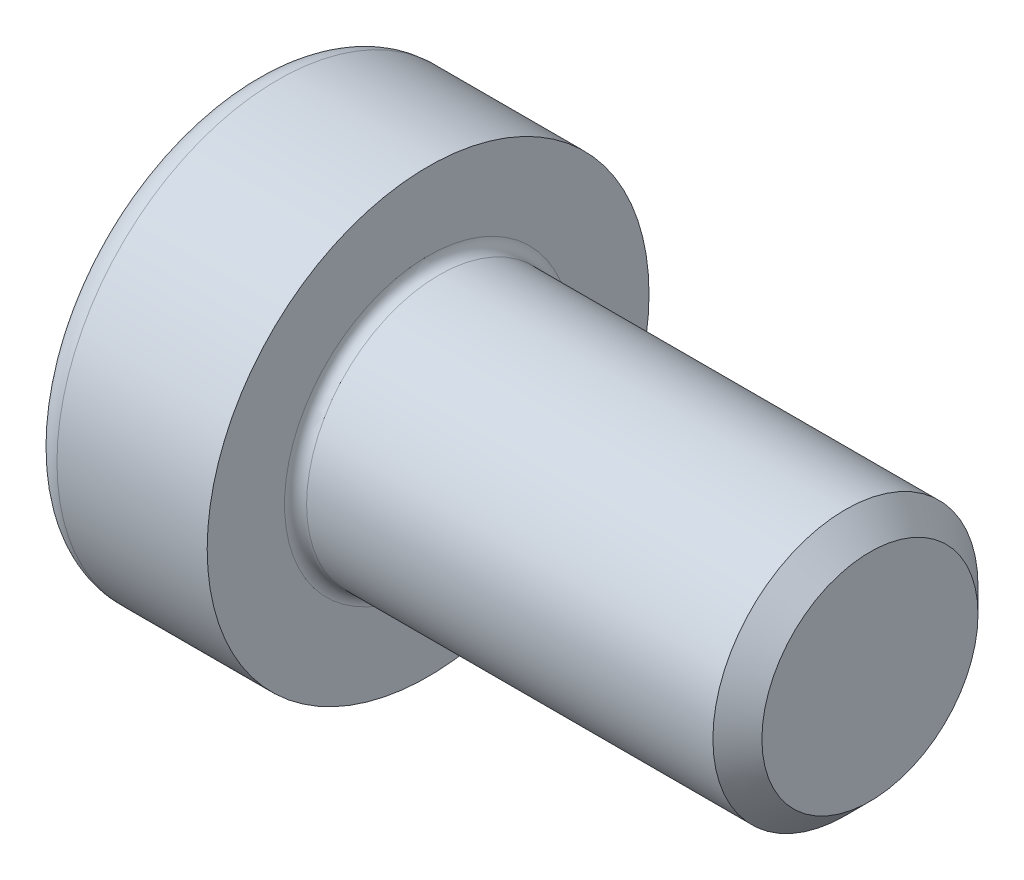
ISO-10303-21;
HEADER;
FILE_DESCRIPTION(('STEP AP214'),'2;1');
FILE_NAME('part.step','',(''),(''),'','','');
FILE_SCHEMA(('AUTOMOTIVE_DESIGN { 1 0 10303 214 1 1 1 1 }'));
ENDSEC;
DATA;
#1=APPLICATION_CONTEXT('core data for automotive mechanical design processes');
#2=APPLICATION_PROTOCOL_DEFINITION('international standard','automotive_design',2000,#1);
#3=PRODUCT_CONTEXT('',#1,'mechanical');
#4=PRODUCT('Part','Part','',(#3));
#5=PRODUCT_RELATED_PRODUCT_CATEGORY('part','',(#4));
#6=PRODUCT_DEFINITION_FORMATION('','',#4);
#7=PRODUCT_DEFINITION_CONTEXT('part definition',#1,'design');
#8=PRODUCT_DEFINITION('design','',#6,#7);
#9=PRODUCT_DEFINITION_SHAPE('','',#8);
#10=(LENGTH_UNIT() NAMED_UNIT(*) SI_UNIT(.MILLI.,.METRE.));
#11=(NAMED_UNIT(*) PLANE_ANGLE_UNIT() SI_UNIT($,.RADIAN.));
#12=(NAMED_UNIT(*) SI_UNIT($,.STERADIAN.) SOLID_ANGLE_UNIT());
#13=UNCERTAINTY_MEASURE_WITH_UNIT(LENGTH_MEASURE(1.E-05),#10,'distance_accuracy_value','');
#14=(GEOMETRIC_REPRESENTATION_CONTEXT(3) GLOBAL_UNCERTAINTY_ASSIGNED_CONTEXT((#13)) GLOBAL_UNIT_ASSIGNED_CONTEXT((#10,
#11,#12)) REPRESENTATION_CONTEXT('',''));
#15=CARTESIAN_POINT('',(0.,0.,0.));
#16=DIRECTION('',(0.,0.,1.));
#17=DIRECTION('',(1.,0.,0.));
#18=AXIS2_PLACEMENT_3D('',#15,#16,#17);
#19=CARTESIAN_POINT('',(2.5,1.44337567297408,2.49999999999999));
#20=DIRECTION('',(-1.,0.,0.));
#21=DIRECTION('',(0.,0.,1.));
#22=AXIS2_PLACEMENT_3D('',#19,#20,#21);
#23=PLANE('',#22);
#24=CARTESIAN_POINT('',(2.5,0.,0.));
#25=DIRECTION('',(-1.,0.,0.));
#26=DIRECTION('',(0.,0.,1.));
#27=AXIS2_PLACEMENT_3D('',#24,#25,#26);
#28=CIRCLE('',#27,2.5);
#29=CARTESIAN_POINT('',(2.5,0.,2.5));
#30=VERTEX_POINT('',#29);
#31=CARTESIAN_POINT('',(2.5,2.1650635094611,1.24999999999999));
#32=VERTEX_POINT('',#31);
#33=EDGE_CURVE('E117',#30,#32,#28,.T.);
#34=ORIENTED_EDGE('',*,*,#33,.F.);
#35=DIRECTION('',(0.,1.,0.));
#36=VECTOR('',#35,1.);
#37=CARTESIAN_POINT('',(2.5,-1.44337567297405,2.5));
#38=LINE('',#37,#36);
#39=CARTESIAN_POINT('',(2.5,1.44337567297408,2.49999999999999));
#40=VERTEX_POINT('',#39);
#41=EDGE_CURVE('E124',#30,#40,#38,.T.);
#42=ORIENTED_EDGE('',*,*,#41,.T.);
#43=DIRECTION('',(0.,-0.499999999999997,0.86602540378444));
#44=VECTOR('',#43,1.);
#45=CARTESIAN_POINT('',(2.5,2.88675134594813,0.));
#46=LINE('',#45,#44);
#47=EDGE_CURVE('E125',#32,#40,#46,.T.);
#48=ORIENTED_EDGE('',*,*,#47,.F.);
#49=EDGE_LOOP('',(#34,#42,#48));
#50=FACE_BOUND('',#49,.T.);
#51=ADVANCED_FACE('F33',(#50),#23,.T.);
#52=CARTESIAN_POINT('',(2.5,0.,0.));
#53=DIRECTION('',(-1.,0.,0.));
#54=DIRECTION('',(0.,0.,1.));
#55=AXIS2_PLACEMENT_3D('',#52,#53,#54);
#56=CIRCLE('',#55,2.5);
#57=CARTESIAN_POINT('',(2.5,2.1650635094611,-1.25));
#58=VERTEX_POINT('',#57);
#59=EDGE_CURVE('E11',#32,#58,#56,.T.);
#60=ORIENTED_EDGE('',*,*,#59,.F.);
#61=CARTESIAN_POINT('',(2.5,2.88675134594813,0.));
#62=VERTEX_POINT('',#61);
#63=EDGE_CURVE('E121',#62,#32,#46,.T.);
#64=ORIENTED_EDGE('',*,*,#63,.F.);
#65=DIRECTION('',(0.,-0.500000000000001,-0.866025403784438));
#66=VECTOR('',#65,1.);
#67=CARTESIAN_POINT('',(2.5,2.88675134594813,0.));
#68=LINE('',#67,#66);
#69=EDGE_CURVE('E142',#62,#58,#68,.T.);
#70=ORIENTED_EDGE('',*,*,#69,.T.);
#71=EDGE_LOOP('',(#60,#64,#70));
#72=FACE_BOUND('',#71,.T.);
#73=ADVANCED_FACE('F246',(#72),#23,.T.);
#74=CARTESIAN_POINT('',(2.5,0.,-2.5));
#75=VERTEX_POINT('',#74);
#76=EDGE_CURVE('E42',#58,#75,#56,.T.);
#77=ORIENTED_EDGE('',*,*,#76,.F.);
#78=CARTESIAN_POINT('',(2.5,1.44337567297407,-2.50000000000001));
#79=VERTEX_POINT('',#78);
#80=EDGE_CURVE('E141',#58,#79,#68,.T.);
#81=ORIENTED_EDGE('',*,*,#80,.T.);
#82=DIRECTION('',(0.,-1.,0.));
#83=VECTOR('',#82,1.);
#84=CARTESIAN_POINT('',(2.5,1.44337567297407,-2.50000000000001));
#85=LINE('',#84,#83);
#86=EDGE_CURVE('E138',#79,#75,#85,.T.);
#87=ORIENTED_EDGE('',*,*,#86,.T.);
#88=EDGE_LOOP('',(#77,#81,#87));
#89=FACE_BOUND('',#88,.T.);
#90=ADVANCED_FACE('F211',(#89),#23,.T.);
#91=CARTESIAN_POINT('',(2.5,-2.1650635094611,-1.24999999999999));
#92=VERTEX_POINT('',#91);
#93=EDGE_CURVE('E195',#75,#92,#56,.T.);
#94=ORIENTED_EDGE('',*,*,#93,.F.);
#95=CARTESIAN_POINT('',(2.5,-1.44337567297406,-2.5));
#96=VERTEX_POINT('',#95);
#97=EDGE_CURVE('E137',#75,#96,#85,.T.);
#98=ORIENTED_EDGE('',*,*,#97,.T.);
#99=DIRECTION('',(0.,0.499999999999998,-0.86602540378444));
#100=VECTOR('',#99,1.);
#101=CARTESIAN_POINT('',(2.5,-2.88675134594812,0.));
#102=LINE('',#101,#100);
#103=EDGE_CURVE('E133',#92,#96,#102,.T.);
#104=ORIENTED_EDGE('',*,*,#103,.F.);
#105=EDGE_LOOP('',(#94,#98,#104));
#106=FACE_BOUND('',#105,.T.);
#107=ADVANCED_FACE('F206',(#106),#23,.T.);
#108=CARTESIAN_POINT('',(2.5,-2.16506350946109,1.25));
#109=VERTEX_POINT('',#108);
#110=EDGE_CURVE('E49',#92,#109,#56,.T.);
#111=ORIENTED_EDGE('',*,*,#110,.F.);
#112=CARTESIAN_POINT('',(2.5,-2.88675134594812,0.));
#113=VERTEX_POINT('',#112);
#114=EDGE_CURVE('E134',#113,#92,#102,.T.);
#115=ORIENTED_EDGE('',*,*,#114,.F.);
#116=DIRECTION('',(0.,-0.500000000000001,-0.866025403784438));
#117=VECTOR('',#116,1.);
#118=CARTESIAN_POINT('',(2.5,-1.44337567297405,2.5));
#119=LINE('',#118,#117);
#120=EDGE_CURVE('E129',#109,#113,#119,.T.);
#121=ORIENTED_EDGE('',*,*,#120,.F.);
#122=EDGE_LOOP('',(#111,#115,#121));
#123=FACE_BOUND('',#122,.T.);
#124=ADVANCED_FACE('F229',(#123),#23,.T.);
#125=CARTESIAN_POINT('',(0.,0.,0.));
#126=DIRECTION('',(-1.,0.,0.));
#127=DIRECTION('',(0.,0.,1.));
#128=AXIS2_PLACEMENT_3D('',#125,#126,#127);
#129=PLANE('',#128);
#130=CARTESIAN_POINT('',(0.,0.,0.));
#131=DIRECTION('',(-1.,0.,0.));
#132=DIRECTION('',(0.,0.,1.));
#133=AXIS2_PLACEMENT_3D('',#130,#131,#132);
#134=CIRCLE('',#133,4.4);
#135=CARTESIAN_POINT('',(0.,0.,4.4));
#136=VERTEX_POINT('',#135);
#137=EDGE_CURVE('E188',#136,#136,#134,.T.);
#138=ORIENTED_EDGE('',*,*,#137,.T.);
#139=EDGE_LOOP('',(#138));
#140=FACE_BOUND('',#139,.T.);
#141=DIRECTION('',(0.,-0.500000000000001,-0.866025403784438));
#142=VECTOR('',#141,1.);
#143=CARTESIAN_POINT('',(0.,2.88675134594813,0.));
#144=LINE('',#143,#142);
#145=CARTESIAN_POINT('',(0.,2.88675134594813,0.));
#146=VERTEX_POINT('',#145);
#147=CARTESIAN_POINT('',(0.,1.44337567297407,-2.50000000000001));
#148=VERTEX_POINT('',#147);
#149=EDGE_CURVE('E157',#146,#148,#144,.T.);
#150=ORIENTED_EDGE('',*,*,#149,.F.);
#151=DIRECTION('',(0.,-0.499999999999997,0.86602540378444));
#152=VECTOR('',#151,1.);
#153=CARTESIAN_POINT('',(0.,2.88675134594813,0.));
#154=LINE('',#153,#152);
#155=CARTESIAN_POINT('',(0.,1.44337567297408,2.49999999999999));
#156=VERTEX_POINT('',#155);
#157=EDGE_CURVE('E57',#146,#156,#154,.T.);
#158=ORIENTED_EDGE('',*,*,#157,.T.);
#159=DIRECTION('',(0.,1.,0.));
#160=VECTOR('',#159,1.);
#161=CARTESIAN_POINT('',(0.,-1.44337567297405,2.5));
#162=LINE('',#161,#160);
#163=CARTESIAN_POINT('',(0.,-1.44337567297405,2.5));
#164=VERTEX_POINT('',#163);
#165=EDGE_CURVE('E147',#164,#156,#162,.T.);
#166=ORIENTED_EDGE('',*,*,#165,.F.);
#167=DIRECTION('',(0.,-0.500000000000001,-0.866025403784438));
#168=VECTOR('',#167,1.);
#169=CARTESIAN_POINT('',(0.,-1.44337567297405,2.5));
#170=LINE('',#169,#168);
#171=CARTESIAN_POINT('',(0.,-2.88675134594812,0.));
#172=VERTEX_POINT('',#171);
#173=EDGE_CURVE('E150',#164,#172,#170,.T.);
#174=ORIENTED_EDGE('',*,*,#173,.T.);
#175=DIRECTION('',(0.,0.499999999999998,-0.86602540378444));
#176=VECTOR('',#175,1.);
#177=CARTESIAN_POINT('',(0.,-2.88675134594812,0.));
#178=LINE('',#177,#176);
#179=CARTESIAN_POINT('',(0.,-1.44337567297406,-2.5));
#180=VERTEX_POINT('',#179);
#181=EDGE_CURVE('E152',#172,#180,#178,.T.);
#182=ORIENTED_EDGE('',*,*,#181,.T.);
#183=DIRECTION('',(0.,-1.,0.));
#184=VECTOR('',#183,1.);
#185=CARTESIAN_POINT('',(0.,1.44337567297407,-2.50000000000001));
#186=LINE('',#185,#184);
#187=EDGE_CURVE('E154',#148,#180,#186,.T.);
#188=ORIENTED_EDGE('',*,*,#187,.F.);
#189=EDGE_LOOP('',(#150,#158,#166,#174,#182,#188));
#190=FACE_BOUND('',#189,.T.);
#191=ADVANCED_FACE('F219',(#140,#190),#129,.T.);
#192=CARTESIAN_POINT('',(-31.75,0.,0.));
#193=DIRECTION('',(-1.,0.,0.));
#194=DIRECTION('',(0.,0.,1.));
#195=AXIS2_PLACEMENT_3D('',#192,#193,#194);
#196=CYLINDRICAL_SURFACE('',#195,5.);
#197=CARTESIAN_POINT('',(0.600000000000003,0.,0.));
#198=DIRECTION('',(-1.,0.,0.));
#199=DIRECTION('',(0.,0.,1.));
#200=AXIS2_PLACEMENT_3D('',#197,#198,#199);
#201=CIRCLE('',#200,5.);
#202=CARTESIAN_POINT('',(0.600000000000003,0.,5.));
#203=VERTEX_POINT('',#202);
#204=EDGE_CURVE('E190',#203,#203,#201,.F.);
#205=ORIENTED_EDGE('',*,*,#204,.T.);
#206=EDGE_LOOP('',(#205));
#207=FACE_BOUND('',#206,.T.);
#208=CARTESIAN_POINT('',(4.,0.,0.));
#209=DIRECTION('',(-1.,0.,0.));
#210=DIRECTION('',(0.,0.,1.));
#211=AXIS2_PLACEMENT_3D('',#208,#209,#210);
#212=CIRCLE('',#211,5.);
#213=CARTESIAN_POINT('',(4.,0.,5.));
#214=VERTEX_POINT('',#213);
#215=EDGE_CURVE('E179',#214,#214,#212,.T.);
#216=ORIENTED_EDGE('',*,*,#215,.T.);
#217=EDGE_LOOP('',(#216));
#218=FACE_BOUND('',#217,.T.);
#219=ADVANCED_FACE('F285',(#207,#218),#196,.T.);
#220=CARTESIAN_POINT('',(4.,5.,0.));
#221=DIRECTION('',(1.,0.,0.));
#222=DIRECTION('',(0.,0.,-1.));
#223=AXIS2_PLACEMENT_3D('',#220,#221,#222);
#224=PLANE('',#223);
#225=CARTESIAN_POINT('',(4.,0.,0.));
#226=DIRECTION('',(1.,0.,0.));
#227=DIRECTION('',(0.,0.,-1.));
#228=AXIS2_PLACEMENT_3D('',#225,#226,#227);
#229=CIRCLE('',#228,3.25);
#230=CARTESIAN_POINT('',(4.,0.,-3.25));
#231=VERTEX_POINT('',#230);
#232=EDGE_CURVE('E182',#231,#231,#229,.F.);
#233=ORIENTED_EDGE('',*,*,#232,.T.);
#234=EDGE_LOOP('',(#233));
#235=FACE_BOUND('',#234,.T.);
#236=ORIENTED_EDGE('',*,*,#215,.F.);
#237=EDGE_LOOP('',(#236));
#238=FACE_BOUND('',#237,.T.);
#239=ADVANCED_FACE('F281',(#235,#238),#224,.T.);
#240=CARTESIAN_POINT('',(-31.75,0.,0.));
#241=DIRECTION('',(-1.,0.,0.));
#242=DIRECTION('',(0.,0.,1.));
#243=AXIS2_PLACEMENT_3D('',#240,#241,#242);
#244=CYLINDRICAL_SURFACE('',#243,3.);
#245=CARTESIAN_POINT('',(4.25,0.,0.));
#246=DIRECTION('',(1.,0.,0.));
#247=DIRECTION('',(0.,0.,-1.));
#248=AXIS2_PLACEMENT_3D('',#245,#246,#247);
#249=CIRCLE('',#248,3.);
#250=CARTESIAN_POINT('',(4.25,0.,-3.));
#251=VERTEX_POINT('',#250);
#252=EDGE_CURVE('E185',#251,#251,#249,.T.);
#253=ORIENTED_EDGE('',*,*,#252,.T.);
#254=EDGE_LOOP('',(#253));
#255=FACE_BOUND('',#254,.T.);
#256=CARTESIAN_POINT('',(13.4455,0.,0.));
#257=DIRECTION('',(-1.,0.,0.));
#258=DIRECTION('',(0.,0.,1.));
#259=AXIS2_PLACEMENT_3D('',#256,#257,#258);
#260=CIRCLE('',#259,3.);
#261=CARTESIAN_POINT('',(13.4455,0.,3.));
#262=VERTEX_POINT('',#261);
#263=EDGE_CURVE('E176',#262,#262,#260,.T.);
#264=ORIENTED_EDGE('',*,*,#263,.T.);
#265=EDGE_LOOP('',(#264));
#266=FACE_BOUND('',#265,.T.);
#267=ADVANCED_FACE('F277',(#255,#266),#244,.T.);
#268=CARTESIAN_POINT('',(14.,0.,0.));
#269=DIRECTION('',(-1.,0.,0.));
#270=DIRECTION('',(0.,0.,1.));
#271=AXIS2_PLACEMENT_3D('',#268,#269,#270);
#272=CONICAL_SURFACE('',#271,2.4455,0.785398163397448);
#273=ORIENTED_EDGE('',*,*,#263,.F.);
#274=EDGE_LOOP('',(#273));
#275=FACE_BOUND('',#274,.T.);
#276=CARTESIAN_POINT('',(14.,0.,0.));
#277=DIRECTION('',(-1.,0.,0.));
#278=DIRECTION('',(0.,0.,1.));
#279=AXIS2_PLACEMENT_3D('',#276,#277,#278);
#280=CIRCLE('',#279,2.4455);
#281=CARTESIAN_POINT('',(14.,0.,2.4455));
#282=VERTEX_POINT('',#281);
#283=EDGE_CURVE('E173',#282,#282,#280,.T.);
#284=ORIENTED_EDGE('',*,*,#283,.T.);
#285=EDGE_LOOP('',(#284));
#286=FACE_BOUND('',#285,.T.);
#287=ADVANCED_FACE('F273',(#275,#286),#272,.T.);
#288=CARTESIAN_POINT('',(14.,2.4455,0.));
#289=DIRECTION('',(1.,0.,0.));
#290=DIRECTION('',(0.,0.,-1.));
#291=AXIS2_PLACEMENT_3D('',#288,#289,#290);
#292=PLANE('',#291);
#293=ORIENTED_EDGE('',*,*,#283,.F.);
#294=EDGE_LOOP('',(#293));
#295=FACE_BOUND('',#294,.T.);
#296=ADVANCED_FACE('F269',(#295),#292,.T.);
#297=CARTESIAN_POINT('',(4.25,0.,0.));
#298=DIRECTION('',(1.,0.,0.));
#299=DIRECTION('',(0.,0.,-1.));
#300=AXIS2_PLACEMENT_3D('',#297,#298,#299);
#301=TOROIDAL_SURFACE('',#300,3.25,0.25);
#302=ORIENTED_EDGE('',*,*,#252,.F.);
#303=EDGE_LOOP('',(#302));
#304=FACE_BOUND('',#303,.T.);
#305=ORIENTED_EDGE('',*,*,#232,.F.);
#306=EDGE_LOOP('',(#305));
#307=FACE_BOUND('',#306,.T.);
#308=ADVANCED_FACE('F272',(#304,#307),#301,.F.);
#309=CARTESIAN_POINT('',(0.600000000000003,0.,0.));
#310=DIRECTION('',(-1.,0.,0.));
#311=DIRECTION('',(0.,0.,1.));
#312=AXIS2_PLACEMENT_3D('',#309,#310,#311);
#313=TOROIDAL_SURFACE('',#312,4.4,0.6);
#314=ORIENTED_EDGE('',*,*,#204,.F.);
#315=EDGE_LOOP('',(#314));
#316=FACE_BOUND('',#315,.T.);
#317=ORIENTED_EDGE('',*,*,#137,.F.);
#318=EDGE_LOOP('',(#317));
#319=FACE_BOUND('',#318,.T.);
#320=ADVANCED_FACE('F35',(#316,#319),#313,.T.);
#321=CARTESIAN_POINT('',(2.5,2.88675134594813,0.));
#322=DIRECTION('',(0.,-0.86602540378444,-0.499999999999997));
#323=DIRECTION('',(0.,0.499999999999998,-0.86602540378444));
#324=AXIS2_PLACEMENT_3D('',#321,#322,#323);
#325=PLANE('',#324);
#326=DIRECTION('',(-1.,0.,0.));
#327=VECTOR('',#326,1.);
#328=CARTESIAN_POINT('',(2.5,1.44337567297408,2.49999999999999));
#329=LINE('',#328,#327);
#330=EDGE_CURVE('E171',#40,#156,#329,.T.);
#331=ORIENTED_EDGE('',*,*,#330,.T.);
#332=ORIENTED_EDGE('',*,*,#157,.F.);
#333=DIRECTION('',(-1.,0.,0.));
#334=VECTOR('',#333,1.);
#335=CARTESIAN_POINT('',(2.5,2.88675134594813,0.));
#336=LINE('',#335,#334);
#337=EDGE_CURVE('E145',#62,#146,#336,.T.);
#338=ORIENTED_EDGE('',*,*,#337,.F.);
#339=ORIENTED_EDGE('',*,*,#63,.T.);
#340=ORIENTED_EDGE('',*,*,#47,.T.);
#341=EDGE_LOOP('',(#331,#332,#338,#339,#340));
#342=FACE_BOUND('',#341,.T.);
#343=ADVANCED_FACE('F243',(#342),#325,.T.);
#344=CARTESIAN_POINT('',(2.5,-1.44337567297405,2.5));
#345=DIRECTION('',(0.,0.,1.));
#346=DIRECTION('',(0.,-1.,0.));
#347=AXIS2_PLACEMENT_3D('',#344,#345,#346);
#348=PLANE('',#347);
#349=ORIENTED_EDGE('',*,*,#41,.F.);
#350=CARTESIAN_POINT('',(2.5,-1.44337567297405,2.5));
#351=VERTEX_POINT('',#350);
#352=EDGE_CURVE('E126',#351,#30,#38,.T.);
#353=ORIENTED_EDGE('',*,*,#352,.F.);
#354=DIRECTION('',(-1.,0.,0.));
#355=VECTOR('',#354,1.);
#356=CARTESIAN_POINT('',(2.5,-1.44337567297405,2.5));
#357=LINE('',#356,#355);
#358=EDGE_CURVE('E169',#351,#164,#357,.T.);
#359=ORIENTED_EDGE('',*,*,#358,.T.);
#360=ORIENTED_EDGE('',*,*,#165,.T.);
#361=ORIENTED_EDGE('',*,*,#330,.F.);
#362=EDGE_LOOP('',(#349,#353,#359,#360,#361));
#363=FACE_BOUND('',#362,.T.);
#364=ADVANCED_FACE('F238',(#363),#348,.F.);
#365=CARTESIAN_POINT('',(2.5,-1.44337567297405,2.5));
#366=DIRECTION('',(0.,0.866025403784438,-0.500000000000001));
#367=DIRECTION('',(0.,0.500000000000001,0.866025403784438));
#368=AXIS2_PLACEMENT_3D('',#365,#366,#367);
#369=PLANE('',#368);
#370=DIRECTION('',(-1.,0.,0.));
#371=VECTOR('',#370,1.);
#372=CARTESIAN_POINT('',(2.5,-2.88675134594812,0.));
#373=LINE('',#372,#371);
#374=EDGE_CURVE('E166',#113,#172,#373,.T.);
#375=ORIENTED_EDGE('',*,*,#374,.T.);
#376=ORIENTED_EDGE('',*,*,#173,.F.);
#377=ORIENTED_EDGE('',*,*,#358,.F.);
#378=EDGE_CURVE('E130',#351,#109,#119,.T.);
#379=ORIENTED_EDGE('',*,*,#378,.T.);
#380=ORIENTED_EDGE('',*,*,#120,.T.);
#381=EDGE_LOOP('',(#375,#376,#377,#379,#380));
#382=FACE_BOUND('',#381,.T.);
#383=ADVANCED_FACE('F232',(#382),#369,.T.);
#384=CARTESIAN_POINT('',(2.5,-2.88675134594812,0.));
#385=DIRECTION('',(0.,0.86602540378444,0.499999999999998));
#386=DIRECTION('',(0.,-0.499999999999998,0.86602540378444));
#387=AXIS2_PLACEMENT_3D('',#384,#385,#386);
#388=PLANE('',#387);
#389=DIRECTION('',(-1.,0.,0.));
#390=VECTOR('',#389,1.);
#391=CARTESIAN_POINT('',(2.5,-1.44337567297406,-2.5));
#392=LINE('',#391,#390);
#393=EDGE_CURVE('E163',#96,#180,#392,.T.);
#394=ORIENTED_EDGE('',*,*,#393,.T.);
#395=ORIENTED_EDGE('',*,*,#181,.F.);
#396=ORIENTED_EDGE('',*,*,#374,.F.);
#397=ORIENTED_EDGE('',*,*,#114,.T.);
#398=ORIENTED_EDGE('',*,*,#103,.T.);
#399=EDGE_LOOP('',(#394,#395,#396,#397,#398));
#400=FACE_BOUND('',#399,.T.);
#401=ADVANCED_FACE('F225',(#400),#388,.T.);
#402=CARTESIAN_POINT('',(2.5,1.44337567297407,-2.50000000000001));
#403=DIRECTION('',(0.,0.,-1.));
#404=DIRECTION('',(0.,1.,0.));
#405=AXIS2_PLACEMENT_3D('',#402,#403,#404);
#406=PLANE('',#405);
#407=ORIENTED_EDGE('',*,*,#97,.F.);
#408=ORIENTED_EDGE('',*,*,#86,.F.);
#409=DIRECTION('',(-1.,0.,0.));
#410=VECTOR('',#409,1.);
#411=CARTESIAN_POINT('',(2.5,1.44337567297407,-2.50000000000001));
#412=LINE('',#411,#410);
#413=EDGE_CURVE('E160',#79,#148,#412,.T.);
#414=ORIENTED_EDGE('',*,*,#413,.T.);
#415=ORIENTED_EDGE('',*,*,#187,.T.);
#416=ORIENTED_EDGE('',*,*,#393,.F.);
#417=EDGE_LOOP('',(#407,#408,#414,#415,#416));
#418=FACE_BOUND('',#417,.T.);
#419=ADVANCED_FACE('F210',(#418),#406,.F.);
#420=CARTESIAN_POINT('',(2.5,2.88675134594813,0.));
#421=DIRECTION('',(0.,0.866025403784438,-0.500000000000001));
#422=DIRECTION('',(0.,0.500000000000001,0.866025403784438));
#423=AXIS2_PLACEMENT_3D('',#420,#421,#422);
#424=PLANE('',#423);
#425=ORIENTED_EDGE('',*,*,#80,.F.);
#426=ORIENTED_EDGE('',*,*,#69,.F.);
#427=ORIENTED_EDGE('',*,*,#337,.T.);
#428=ORIENTED_EDGE('',*,*,#149,.T.);
#429=ORIENTED_EDGE('',*,*,#413,.F.);
#430=EDGE_LOOP('',(#425,#426,#427,#428,#429));
#431=FACE_BOUND('',#430,.T.);
#432=ADVANCED_FACE('F215',(#431),#424,.F.);
#433=EDGE_CURVE('E37',#109,#30,#56,.T.);
#434=ORIENTED_EDGE('',*,*,#433,.F.);
#435=ORIENTED_EDGE('',*,*,#378,.F.);
#436=ORIENTED_EDGE('',*,*,#352,.T.);
#437=EDGE_LOOP('',(#434,#435,#436));
#438=FACE_BOUND('',#437,.T.);
#439=ADVANCED_FACE('F235',(#438),#23,.T.);
#440=CARTESIAN_POINT('',(2.5,0.,0.));
#441=DIRECTION('',(-1.,0.,0.));
#442=DIRECTION('',(0.,0.,1.));
#443=AXIS2_PLACEMENT_3D('',#440,#441,#442);
#444=CONICAL_SURFACE('',#443,2.5,1.04719755119659);
#445=CARTESIAN_POINT('',(3.07735026918963,0.,0.));
#446=DIRECTION('',(-1.,0.,0.));
#447=DIRECTION('',(0.,0.,1.));
#448=AXIS2_PLACEMENT_3D('',#445,#446,#447);
#449=CIRCLE('',#448,1.5);
#450=CARTESIAN_POINT('',(3.07735026918963,0.,1.5));
#451=VERTEX_POINT('',#450);
#452=EDGE_CURVE('E114',#451,#451,#449,.T.);
#453=ORIENTED_EDGE('',*,*,#452,.F.);
#454=EDGE_LOOP('',(#453));
#455=FACE_BOUND('',#454,.T.);
#456=ORIENTED_EDGE('',*,*,#33,.T.);
#457=ORIENTED_EDGE('',*,*,#59,.T.);
#458=ORIENTED_EDGE('',*,*,#76,.T.);
#459=ORIENTED_EDGE('',*,*,#93,.T.);
#460=ORIENTED_EDGE('',*,*,#110,.T.);
#461=ORIENTED_EDGE('',*,*,#433,.T.);
#462=EDGE_LOOP('',(#456,#457,#458,#459,#460,#461));
#463=FACE_BOUND('',#462,.T.);
#464=ADVANCED_FACE('F198',(#455,#463),#444,.F.);
#465=CARTESIAN_POINT('',(0.,0.,0.));
#466=DIRECTION('',(-1.,0.,0.));
#467=DIRECTION('',(0.,0.,1.));
#468=AXIS2_PLACEMENT_3D('',#465,#466,#467);
#469=CYLINDRICAL_SURFACE('',#468,1.5);
#470=CARTESIAN_POINT('',(5.,0.,0.));
#471=DIRECTION('',(-1.,0.,0.));
#472=DIRECTION('',(0.,0.,1.));
#473=AXIS2_PLACEMENT_3D('',#470,#471,#472);
#474=CIRCLE('',#473,1.5);
#475=CARTESIAN_POINT('',(5.,0.,1.5));
#476=VERTEX_POINT('',#475);
#477=EDGE_CURVE('E112',#476,#476,#474,.T.);
#478=ORIENTED_EDGE('',*,*,#477,.F.);
#479=EDGE_LOOP('',(#478));
#480=FACE_BOUND('',#479,.T.);
#481=ORIENTED_EDGE('',*,*,#452,.T.);
#482=EDGE_LOOP('',(#481));
#483=FACE_BOUND('',#482,.T.);
#484=ADVANCED_FACE('F108',(#480,#483),#469,.F.);
#485=CARTESIAN_POINT('',(5.,0.,0.));
#486=DIRECTION('',(-1.,0.,0.));
#487=DIRECTION('',(0.,0.,1.));
#488=AXIS2_PLACEMENT_3D('',#485,#486,#487);
#489=CONICAL_SURFACE('',#488,1.5,1.04719755119659);
#490=CARTESIAN_POINT('',(5.86602540378445,0.,0.));
#491=VERTEX_POINT('',#490);
#492=VERTEX_LOOP('',#491);
#493=FACE_BOUND('',#492,.T.);
#494=ORIENTED_EDGE('',*,*,#477,.T.);
#495=EDGE_LOOP('',(#494));
#496=FACE_BOUND('',#495,.T.);
#497=ADVANCED_FACE('F105',(#493,#496),#489,.F.);
#498=CLOSED_SHELL('',(#51,#73,#90,#107,#124,#191,#219,#239,#267,#287,#296,#308,#320,#343,#364,
#383,#401,#419,#432,#439,#464,#484,#497));
#499=MANIFOLD_SOLID_BREP('B2',#498);
#500=ADVANCED_BREP_SHAPE_REPRESENTATION('',(#18,#499),#14);
#501=SHAPE_DEFINITION_REPRESENTATION(#9,#500);
ENDSEC;
END-ISO-10303-21;
